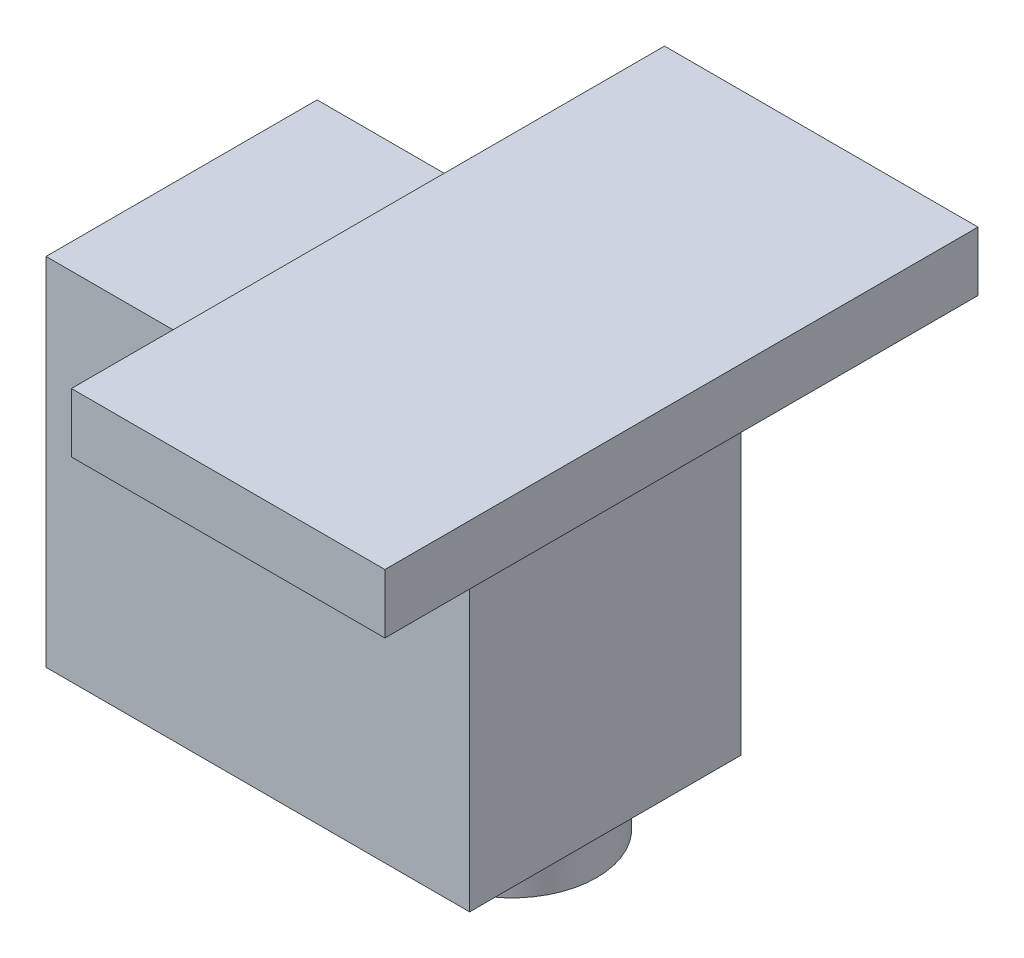
ISO-10303-21;
HEADER;
FILE_DESCRIPTION(('STEP AP214'),'2;1');
FILE_NAME('part.step','',(''),(''),'','','');
FILE_SCHEMA(('AUTOMOTIVE_DESIGN { 1 0 10303 214 1 1 1 1 }'));
ENDSEC;
DATA;
#1=APPLICATION_CONTEXT('core data for automotive mechanical design processes');
#2=APPLICATION_PROTOCOL_DEFINITION('international standard','automotive_design',2000,#1);
#3=PRODUCT_CONTEXT('',#1,'mechanical');
#4=PRODUCT('Part','Part','',(#3));
#5=PRODUCT_RELATED_PRODUCT_CATEGORY('part','',(#4));
#6=PRODUCT_DEFINITION_FORMATION('','',#4);
#7=PRODUCT_DEFINITION_CONTEXT('part definition',#1,'design');
#8=PRODUCT_DEFINITION('design','',#6,#7);
#9=PRODUCT_DEFINITION_SHAPE('','',#8);
#10=(LENGTH_UNIT() NAMED_UNIT(*) SI_UNIT(.MILLI.,.METRE.));
#11=(NAMED_UNIT(*) PLANE_ANGLE_UNIT() SI_UNIT($,.RADIAN.));
#12=(NAMED_UNIT(*) SI_UNIT($,.STERADIAN.) SOLID_ANGLE_UNIT());
#13=UNCERTAINTY_MEASURE_WITH_UNIT(LENGTH_MEASURE(1.E-05),#10,'distance_accuracy_value','');
#14=(GEOMETRIC_REPRESENTATION_CONTEXT(3) GLOBAL_UNCERTAINTY_ASSIGNED_CONTEXT((#13)) GLOBAL_UNIT_ASSIGNED_CONTEXT((#10,
#11,#12)) REPRESENTATION_CONTEXT('',''));
#15=CARTESIAN_POINT('',(0.,0.,0.));
#16=DIRECTION('',(0.,0.,1.));
#17=DIRECTION('',(1.,0.,0.));
#18=AXIS2_PLACEMENT_3D('',#15,#16,#17);
#19=CARTESIAN_POINT('',(0.,21.,16.));
#20=DIRECTION('',(0.,1.,0.));
#21=DIRECTION('',(0.,0.,1.));
#22=AXIS2_PLACEMENT_3D('',#19,#20,#21);
#23=PLANE('',#22);
#24=DIRECTION('',(0.,0.,-1.));
#25=VECTOR('',#24,1.);
#26=CARTESIAN_POINT('',(-3.00000000000001,21.,35.));
#27=LINE('',#26,#25);
#28=CARTESIAN_POINT('',(-3.00000000000001,21.,16.));
#29=VERTEX_POINT('',#28);
#30=CARTESIAN_POINT('',(-3.00000000000001,21.,-16.));
#31=VERTEX_POINT('',#30);
#32=EDGE_CURVE('E45',#29,#31,#27,.T.);
#33=ORIENTED_EDGE('',*,*,#32,.T.);
#34=DIRECTION('',(1.,0.,0.));
#35=VECTOR('',#34,1.);
#36=CARTESIAN_POINT('',(0.,21.,-16.));
#37=LINE('',#36,#35);
#38=CARTESIAN_POINT('',(-25.,21.,-16.));
#39=VERTEX_POINT('',#38);
#40=EDGE_CURVE('E165',#39,#31,#37,.T.);
#41=ORIENTED_EDGE('',*,*,#40,.F.);
#42=DIRECTION('',(0.,0.,-1.));
#43=VECTOR('',#42,1.);
#44=CARTESIAN_POINT('',(-25.,21.,16.));
#45=LINE('',#44,#43);
#46=CARTESIAN_POINT('',(-25.,21.,16.));
#47=VERTEX_POINT('',#46);
#48=EDGE_CURVE('E187',#47,#39,#45,.T.);
#49=ORIENTED_EDGE('',*,*,#48,.F.);
#50=DIRECTION('',(1.,0.,0.));
#51=VECTOR('',#50,1.);
#52=CARTESIAN_POINT('',(0.,21.,16.));
#53=LINE('',#52,#51);
#54=EDGE_CURVE('E178',#47,#29,#53,.T.);
#55=ORIENTED_EDGE('',*,*,#54,.T.);
#56=EDGE_LOOP('',(#33,#41,#49,#55));
#57=FACE_BOUND('',#56,.T.);
#58=ADVANCED_FACE('F37',(#57),#23,.T.);
#59=CARTESIAN_POINT('',(25.,0.,16.));
#60=DIRECTION('',(1.,0.,0.));
#61=DIRECTION('',(0.,1.,0.));
#62=AXIS2_PLACEMENT_3D('',#59,#60,#61);
#63=PLANE('',#62);
#64=DIRECTION('',(0.,0.,-1.));
#65=VECTOR('',#64,1.);
#66=CARTESIAN_POINT('',(25.,-21.,16.));
#67=LINE('',#66,#65);
#68=CARTESIAN_POINT('',(25.,-21.,16.));
#69=VERTEX_POINT('',#68);
#70=CARTESIAN_POINT('',(25.,-21.,-16.));
#71=VERTEX_POINT('',#70);
#72=EDGE_CURVE('E183',#69,#71,#67,.T.);
#73=ORIENTED_EDGE('',*,*,#72,.T.);
#74=DIRECTION('',(0.,-1.,0.));
#75=VECTOR('',#74,1.);
#76=CARTESIAN_POINT('',(25.,0.,-16.));
#77=LINE('',#76,#75);
#78=CARTESIAN_POINT('',(25.,21.,-16.));
#79=VERTEX_POINT('',#78);
#80=EDGE_CURVE('E119',#79,#71,#77,.T.);
#81=ORIENTED_EDGE('',*,*,#80,.F.);
#82=DIRECTION('',(0.,0.,-1.));
#83=VECTOR('',#82,1.);
#84=CARTESIAN_POINT('',(25.,21.,16.));
#85=LINE('',#84,#83);
#86=CARTESIAN_POINT('',(25.,21.,16.));
#87=VERTEX_POINT('',#86);
#88=EDGE_CURVE('E188',#87,#79,#85,.T.);
#89=ORIENTED_EDGE('',*,*,#88,.F.);
#90=DIRECTION('',(0.,-1.,0.));
#91=VECTOR('',#90,1.);
#92=CARTESIAN_POINT('',(25.,0.,16.));
#93=LINE('',#92,#91);
#94=EDGE_CURVE('E174',#87,#69,#93,.T.);
#95=ORIENTED_EDGE('',*,*,#94,.T.);
#96=EDGE_LOOP('',(#73,#81,#89,#95));
#97=FACE_BOUND('',#96,.T.);
#98=ADVANCED_FACE('F39',(#97),#63,.T.);
#99=CARTESIAN_POINT('',(-25.,0.,16.));
#100=DIRECTION('',(1.,0.,0.));
#101=DIRECTION('',(0.,1.,0.));
#102=AXIS2_PLACEMENT_3D('',#99,#100,#101);
#103=PLANE('',#102);
#104=ORIENTED_EDGE('',*,*,#48,.T.);
#105=DIRECTION('',(0.,-1.,0.));
#106=VECTOR('',#105,1.);
#107=CARTESIAN_POINT('',(-25.,0.,-16.));
#108=LINE('',#107,#106);
#109=CARTESIAN_POINT('',(-25.,-21.,-16.));
#110=VERTEX_POINT('',#109);
#111=EDGE_CURVE('E168',#39,#110,#108,.T.);
#112=ORIENTED_EDGE('',*,*,#111,.T.);
#113=DIRECTION('',(0.,0.,-1.));
#114=VECTOR('',#113,1.);
#115=CARTESIAN_POINT('',(-25.,-21.,16.));
#116=LINE('',#115,#114);
#117=CARTESIAN_POINT('',(-25.,-21.,16.));
#118=VERTEX_POINT('',#117);
#119=EDGE_CURVE('E185',#118,#110,#116,.T.);
#120=ORIENTED_EDGE('',*,*,#119,.F.);
#121=DIRECTION('',(0.,-1.,0.));
#122=VECTOR('',#121,1.);
#123=CARTESIAN_POINT('',(-25.,0.,16.));
#124=LINE('',#123,#122);
#125=EDGE_CURVE('E57',#47,#118,#124,.T.);
#126=ORIENTED_EDGE('',*,*,#125,.F.);
#127=EDGE_LOOP('',(#104,#112,#120,#126));
#128=FACE_BOUND('',#127,.T.);
#129=ADVANCED_FACE('F200',(#128),#103,.F.);
#130=CARTESIAN_POINT('',(0.,-21.,16.));
#131=DIRECTION('',(0.,1.,0.));
#132=DIRECTION('',(0.,0.,1.));
#133=AXIS2_PLACEMENT_3D('',#130,#131,#132);
#134=PLANE('',#133);
#135=CARTESIAN_POINT('',(14.,-21.,0.));
#136=DIRECTION('',(0.,1.,0.));
#137=DIRECTION('',(0.,0.,1.));
#138=AXIS2_PLACEMENT_3D('',#135,#136,#137);
#139=CIRCLE('',#138,10.);
#140=CARTESIAN_POINT('',(14.,-21.,10.));
#141=VERTEX_POINT('',#140);
#142=EDGE_CURVE('E11',#141,#141,#139,.F.);
#143=ORIENTED_EDGE('',*,*,#142,.F.);
#144=EDGE_LOOP('',(#143));
#145=FACE_BOUND('',#144,.T.);
#146=ORIENTED_EDGE('',*,*,#119,.T.);
#147=DIRECTION('',(1.,0.,0.));
#148=VECTOR('',#147,1.);
#149=CARTESIAN_POINT('',(0.,-21.,-16.));
#150=LINE('',#149,#148);
#151=EDGE_CURVE('E171',#110,#71,#150,.T.);
#152=ORIENTED_EDGE('',*,*,#151,.T.);
#153=ORIENTED_EDGE('',*,*,#72,.F.);
#154=DIRECTION('',(1.,0.,0.));
#155=VECTOR('',#154,1.);
#156=CARTESIAN_POINT('',(0.,-21.,16.));
#157=LINE('',#156,#155);
#158=EDGE_CURVE('E52',#118,#69,#157,.T.);
#159=ORIENTED_EDGE('',*,*,#158,.F.);
#160=EDGE_LOOP('',(#146,#152,#153,#159));
#161=FACE_BOUND('',#160,.T.);
#162=ADVANCED_FACE('F205',(#145,#161),#134,.F.);
#163=CARTESIAN_POINT('',(0.,0.,16.));
#164=DIRECTION('',(0.,0.,1.));
#165=DIRECTION('',(1.,0.,0.));
#166=AXIS2_PLACEMENT_3D('',#163,#164,#165);
#167=PLANE('',#166);
#168=ORIENTED_EDGE('',*,*,#94,.F.);
#169=EDGE_CURVE('E177',#29,#87,#53,.T.);
#170=ORIENTED_EDGE('',*,*,#169,.F.);
#171=ORIENTED_EDGE('',*,*,#54,.F.);
#172=ORIENTED_EDGE('',*,*,#125,.T.);
#173=ORIENTED_EDGE('',*,*,#158,.T.);
#174=EDGE_LOOP('',(#168,#170,#171,#172,#173));
#175=FACE_BOUND('',#174,.T.);
#176=ADVANCED_FACE('F202',(#175),#167,.T.);
#177=CARTESIAN_POINT('',(0.,0.,-16.));
#178=DIRECTION('',(0.,0.,1.));
#179=DIRECTION('',(1.,0.,0.));
#180=AXIS2_PLACEMENT_3D('',#177,#178,#179);
#181=PLANE('',#180);
#182=ORIENTED_EDGE('',*,*,#80,.T.);
#183=ORIENTED_EDGE('',*,*,#151,.F.);
#184=ORIENTED_EDGE('',*,*,#111,.F.);
#185=ORIENTED_EDGE('',*,*,#40,.T.);
#186=DIRECTION('',(1.,0.,0.));
#187=VECTOR('',#186,1.);
#188=CARTESIAN_POINT('',(0.,21.,-16.));
#189=LINE('',#188,#187);
#190=EDGE_CURVE('E145',#31,#79,#189,.T.);
#191=ORIENTED_EDGE('',*,*,#190,.T.);
#192=EDGE_LOOP('',(#182,#183,#184,#185,#191));
#193=FACE_BOUND('',#192,.T.);
#194=ADVANCED_FACE('F197',(#193),#181,.F.);
#195=CARTESIAN_POINT('',(0.,21.,35.));
#196=DIRECTION('',(0.,1.,0.));
#197=DIRECTION('',(0.,0.,1.));
#198=AXIS2_PLACEMENT_3D('',#195,#196,#197);
#199=PLANE('',#198);
#200=ORIENTED_EDGE('',*,*,#169,.T.);
#201=ORIENTED_EDGE('',*,*,#88,.T.);
#202=ORIENTED_EDGE('',*,*,#190,.F.);
#203=DIRECTION('',(0.,0.,1.));
#204=VECTOR('',#203,1.);
#205=CARTESIAN_POINT('',(-3.00000000000001,21.,-35.));
#206=LINE('',#205,#204);
#207=CARTESIAN_POINT('',(-3.00000000000001,21.,-35.));
#208=VERTEX_POINT('',#207);
#209=EDGE_CURVE('E134',#208,#31,#206,.T.);
#210=ORIENTED_EDGE('',*,*,#209,.F.);
#211=DIRECTION('',(1.,0.,0.));
#212=VECTOR('',#211,1.);
#213=CARTESIAN_POINT('',(0.,21.,-35.));
#214=LINE('',#213,#212);
#215=CARTESIAN_POINT('',(34.,21.,-35.));
#216=VERTEX_POINT('',#215);
#217=EDGE_CURVE('E127',#208,#216,#214,.T.);
#218=ORIENTED_EDGE('',*,*,#217,.T.);
#219=DIRECTION('',(0.,0.,-1.));
#220=VECTOR('',#219,1.);
#221=CARTESIAN_POINT('',(34.,21.,35.));
#222=LINE('',#221,#220);
#223=CARTESIAN_POINT('',(34.,21.,35.));
#224=VERTEX_POINT('',#223);
#225=EDGE_CURVE('E109',#224,#216,#222,.T.);
#226=ORIENTED_EDGE('',*,*,#225,.F.);
#227=DIRECTION('',(1.,0.,0.));
#228=VECTOR('',#227,1.);
#229=CARTESIAN_POINT('',(0.,21.,35.));
#230=LINE('',#229,#228);
#231=CARTESIAN_POINT('',(-3.00000000000001,21.,35.));
#232=VERTEX_POINT('',#231);
#233=EDGE_CURVE('E148',#232,#224,#230,.T.);
#234=ORIENTED_EDGE('',*,*,#233,.F.);
#235=EDGE_CURVE('E157',#232,#29,#27,.T.);
#236=ORIENTED_EDGE('',*,*,#235,.T.);
#237=EDGE_LOOP('',(#200,#201,#202,#210,#218,#226,#234,#236));
#238=FACE_BOUND('',#237,.T.);
#239=ADVANCED_FACE('F131',(#238),#199,.F.);
#240=CARTESIAN_POINT('',(34.,0.,35.));
#241=DIRECTION('',(-1.,0.,0.));
#242=DIRECTION('',(0.,0.,1.));
#243=AXIS2_PLACEMENT_3D('',#240,#241,#242);
#244=PLANE('',#243);
#245=ORIENTED_EDGE('',*,*,#225,.T.);
#246=DIRECTION('',(0.,1.,0.));
#247=VECTOR('',#246,1.);
#248=CARTESIAN_POINT('',(34.,0.,-35.));
#249=LINE('',#248,#247);
#250=CARTESIAN_POINT('',(34.,28.,-35.));
#251=VERTEX_POINT('',#250);
#252=EDGE_CURVE('E113',#216,#251,#249,.T.);
#253=ORIENTED_EDGE('',*,*,#252,.T.);
#254=DIRECTION('',(0.,0.,-1.));
#255=VECTOR('',#254,1.);
#256=CARTESIAN_POINT('',(34.,28.,35.));
#257=LINE('',#256,#255);
#258=CARTESIAN_POINT('',(34.,28.,35.));
#259=VERTEX_POINT('',#258);
#260=EDGE_CURVE('E120',#259,#251,#257,.T.);
#261=ORIENTED_EDGE('',*,*,#260,.F.);
#262=DIRECTION('',(0.,1.,0.));
#263=VECTOR('',#262,1.);
#264=CARTESIAN_POINT('',(34.,0.,35.));
#265=LINE('',#264,#263);
#266=EDGE_CURVE('E114',#224,#259,#265,.T.);
#267=ORIENTED_EDGE('',*,*,#266,.F.);
#268=EDGE_LOOP('',(#245,#253,#261,#267));
#269=FACE_BOUND('',#268,.T.);
#270=ADVANCED_FACE('F111',(#269),#244,.F.);
#271=CARTESIAN_POINT('',(0.,28.,35.));
#272=DIRECTION('',(0.,1.,0.));
#273=DIRECTION('',(0.,0.,1.));
#274=AXIS2_PLACEMENT_3D('',#271,#272,#273);
#275=PLANE('',#274);
#276=ORIENTED_EDGE('',*,*,#260,.T.);
#277=DIRECTION('',(1.,0.,0.));
#278=VECTOR('',#277,1.);
#279=CARTESIAN_POINT('',(0.,28.,-35.));
#280=LINE('',#279,#278);
#281=CARTESIAN_POINT('',(-3.00000000000001,28.,-35.));
#282=VERTEX_POINT('',#281);
#283=EDGE_CURVE('E129',#282,#251,#280,.T.);
#284=ORIENTED_EDGE('',*,*,#283,.F.);
#285=DIRECTION('',(0.,0.,-1.));
#286=VECTOR('',#285,1.);
#287=CARTESIAN_POINT('',(-3.00000000000001,28.,35.));
#288=LINE('',#287,#286);
#289=CARTESIAN_POINT('',(-3.00000000000001,28.,35.));
#290=VERTEX_POINT('',#289);
#291=EDGE_CURVE('E160',#290,#282,#288,.T.);
#292=ORIENTED_EDGE('',*,*,#291,.F.);
#293=DIRECTION('',(1.,0.,0.));
#294=VECTOR('',#293,1.);
#295=CARTESIAN_POINT('',(0.,28.,35.));
#296=LINE('',#295,#294);
#297=EDGE_CURVE('E151',#290,#259,#296,.T.);
#298=ORIENTED_EDGE('',*,*,#297,.T.);
#299=EDGE_LOOP('',(#276,#284,#292,#298));
#300=FACE_BOUND('',#299,.T.);
#301=ADVANCED_FACE('F284',(#300),#275,.T.);
#302=CARTESIAN_POINT('',(-3.00000000000001,0.,35.));
#303=DIRECTION('',(-1.,0.,0.));
#304=DIRECTION('',(0.,0.,1.));
#305=AXIS2_PLACEMENT_3D('',#302,#303,#304);
#306=PLANE('',#305);
#307=ORIENTED_EDGE('',*,*,#291,.T.);
#308=DIRECTION('',(0.,1.,0.));
#309=VECTOR('',#308,1.);
#310=CARTESIAN_POINT('',(-3.00000000000001,0.,-35.));
#311=LINE('',#310,#309);
#312=EDGE_CURVE('E142',#208,#282,#311,.T.);
#313=ORIENTED_EDGE('',*,*,#312,.F.);
#314=ORIENTED_EDGE('',*,*,#209,.T.);
#315=ORIENTED_EDGE('',*,*,#32,.F.);
#316=ORIENTED_EDGE('',*,*,#235,.F.);
#317=DIRECTION('',(0.,1.,0.));
#318=VECTOR('',#317,1.);
#319=CARTESIAN_POINT('',(-3.00000000000001,0.,35.));
#320=LINE('',#319,#318);
#321=EDGE_CURVE('E154',#232,#290,#320,.T.);
#322=ORIENTED_EDGE('',*,*,#321,.T.);
#323=EDGE_LOOP('',(#307,#313,#314,#315,#316,#322));
#324=FACE_BOUND('',#323,.T.);
#325=ADVANCED_FACE('F196',(#324),#306,.T.);
#326=CARTESIAN_POINT('',(0.,0.,35.));
#327=DIRECTION('',(0.,0.,1.));
#328=DIRECTION('',(1.,0.,0.));
#329=AXIS2_PLACEMENT_3D('',#326,#327,#328);
#330=PLANE('',#329);
#331=ORIENTED_EDGE('',*,*,#233,.T.);
#332=ORIENTED_EDGE('',*,*,#266,.T.);
#333=ORIENTED_EDGE('',*,*,#297,.F.);
#334=ORIENTED_EDGE('',*,*,#321,.F.);
#335=EDGE_LOOP('',(#331,#332,#333,#334));
#336=FACE_BOUND('',#335,.T.);
#337=ADVANCED_FACE('F242',(#336),#330,.T.);
#338=CARTESIAN_POINT('',(0.,0.,-35.));
#339=DIRECTION('',(0.,0.,1.));
#340=DIRECTION('',(1.,0.,0.));
#341=AXIS2_PLACEMENT_3D('',#338,#339,#340);
#342=PLANE('',#341);
#343=ORIENTED_EDGE('',*,*,#217,.F.);
#344=ORIENTED_EDGE('',*,*,#312,.T.);
#345=ORIENTED_EDGE('',*,*,#283,.T.);
#346=ORIENTED_EDGE('',*,*,#252,.F.);
#347=EDGE_LOOP('',(#343,#344,#345,#346));
#348=FACE_BOUND('',#347,.T.);
#349=ADVANCED_FACE('F125',(#348),#342,.F.);
#350=CARTESIAN_POINT('',(14.,-26.,0.));
#351=DIRECTION('',(0.,1.,0.));
#352=DIRECTION('',(0.,0.,1.));
#353=AXIS2_PLACEMENT_3D('',#350,#351,#352);
#354=CYLINDRICAL_SURFACE('',#353,10.);
#355=CARTESIAN_POINT('',(14.,-26.,0.));
#356=DIRECTION('',(0.,-1.,0.));
#357=DIRECTION('',(0.,0.,-1.));
#358=AXIS2_PLACEMENT_3D('',#355,#356,#357);
#359=CIRCLE('',#358,10.);
#360=CARTESIAN_POINT('',(14.,-26.,-10.));
#361=VERTEX_POINT('',#360);
#362=EDGE_CURVE('E136',#361,#361,#359,.T.);
#363=ORIENTED_EDGE('',*,*,#362,.F.);
#364=EDGE_LOOP('',(#363));
#365=FACE_BOUND('',#364,.T.);
#366=ORIENTED_EDGE('',*,*,#142,.T.);
#367=EDGE_LOOP('',(#366));
#368=FACE_BOUND('',#367,.T.);
#369=ADVANCED_FACE('F312',(#365,#368),#354,.T.);
#370=CARTESIAN_POINT('',(0.,-26.,0.));
#371=DIRECTION('',(0.,-1.,0.));
#372=DIRECTION('',(0.,0.,-1.));
#373=AXIS2_PLACEMENT_3D('',#370,#371,#372);
#374=PLANE('',#373);
#375=ORIENTED_EDGE('',*,*,#362,.T.);
#376=EDGE_LOOP('',(#375));
#377=FACE_BOUND('',#376,.T.);
#378=ADVANCED_FACE('F320',(#377),#374,.T.);
#379=CLOSED_SHELL('',(#58,#98,#129,#162,#176,#194,#239,#270,#301,#325,#337,#349,#369,#378));
#380=MANIFOLD_SOLID_BREP('B2',#379);
#381=ADVANCED_BREP_SHAPE_REPRESENTATION('',(#18,#380),#14);
#382=SHAPE_DEFINITION_REPRESENTATION(#9,#381);
ENDSEC;
END-ISO-10303-21;
